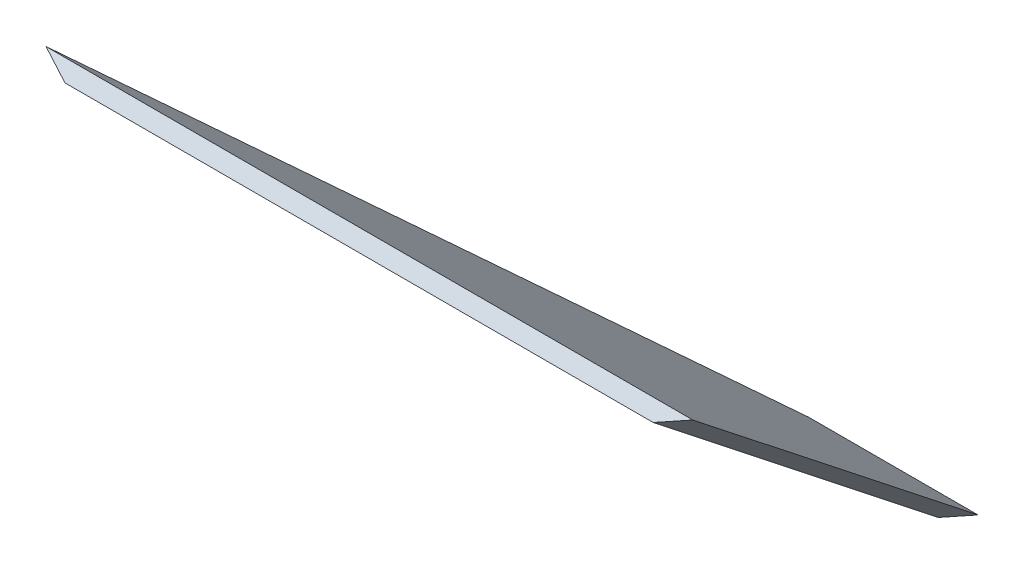
ISO-10303-21;
HEADER;
FILE_DESCRIPTION(('STEP AP214'),'2;1');
FILE_NAME('part.step','',(''),(''),'','','');
FILE_SCHEMA(('AUTOMOTIVE_DESIGN { 1 0 10303 214 1 1 1 1 }'));
ENDSEC;
DATA;
#1=APPLICATION_CONTEXT('core data for automotive mechanical design processes');
#2=APPLICATION_PROTOCOL_DEFINITION('international standard','automotive_design',2000,#1);
#3=PRODUCT_CONTEXT('',#1,'mechanical');
#4=PRODUCT('Part','Part','',(#3));
#5=PRODUCT_RELATED_PRODUCT_CATEGORY('part','',(#4));
#6=PRODUCT_DEFINITION_FORMATION('','',#4);
#7=PRODUCT_DEFINITION_CONTEXT('part definition',#1,'design');
#8=PRODUCT_DEFINITION('design','',#6,#7);
#9=PRODUCT_DEFINITION_SHAPE('','',#8);
#10=(LENGTH_UNIT() NAMED_UNIT(*) SI_UNIT(.MILLI.,.METRE.));
#11=(NAMED_UNIT(*) PLANE_ANGLE_UNIT() SI_UNIT($,.RADIAN.));
#12=(NAMED_UNIT(*) SI_UNIT($,.STERADIAN.) SOLID_ANGLE_UNIT());
#13=UNCERTAINTY_MEASURE_WITH_UNIT(LENGTH_MEASURE(1.E-05),#10,'distance_accuracy_value','');
#14=(GEOMETRIC_REPRESENTATION_CONTEXT(3) GLOBAL_UNCERTAINTY_ASSIGNED_CONTEXT((#13)) GLOBAL_UNIT_ASSIGNED_CONTEXT((#10,
#11,#12)) REPRESENTATION_CONTEXT('',''));
#15=CARTESIAN_POINT('',(0.,0.,0.));
#16=DIRECTION('',(0.,0.,1.));
#17=DIRECTION('',(1.,0.,0.));
#18=AXIS2_PLACEMENT_3D('',#15,#16,#17);
#19=CARTESIAN_POINT('',(-204.997061337424,361.646186737307,597.997319736598));
#20=DIRECTION('',(0.463959634932344,0.757671489646815,-0.458993868074316));
#21=DIRECTION('',(0.852811638118469,-0.522218641844289,0.));
#22=AXIS2_PLACEMENT_3D('',#19,#20,#21);
#23=PLANE('',#22);
#24=DIRECTION('',(0.8827255532639,-0.351898381996991,0.31138902736423));
#25=VECTOR('',#24,1.);
#26=CARTESIAN_POINT('',(153.967453450851,218.545047905128,724.625138207348));
#27=LINE('',#26,#25);
#28=CARTESIAN_POINT('',(-184.121302657974,353.324069319163,605.361423071602));
#29=VERTEX_POINT('',#28);
#30=CARTESIAN_POINT('',(-204.997061337424,361.646186737307,597.997319736598));
#31=VERTEX_POINT('',#30);
#32=EDGE_CURVE('E90',#29,#31,#27,.F.);
#33=ORIENTED_EDGE('',*,*,#32,.T.);
#34=DIRECTION('',(-0.323023809091168,0.62716039849875,0.708749217505827));
#35=VECTOR('',#34,1.);
#36=CARTESIAN_POINT('',(-204.997061337424,361.646186737307,597.997319736598));
#37=LINE('',#36,#35);
#38=CARTESIAN_POINT('',(-34.9249999999667,31.4461867373068,224.84079999998));
#39=VERTEX_POINT('',#38);
#40=EDGE_CURVE('E81',#39,#31,#37,.T.);
#41=ORIENTED_EDGE('',*,*,#40,.F.);
#42=DIRECTION('',(0.8827255532639,-0.351898381996991,0.31138902736423));
#43=VECTOR('',#42,1.);
#44=CARTESIAN_POINT('',(-34.9249999999668,31.4461867373068,224.84079999998));
#45=LINE('',#44,#43);
#46=CARTESIAN_POINT('',(-14.0492413205163,23.1240693191629,232.204903334985));
#47=VERTEX_POINT('',#46);
#48=EDGE_CURVE('E123',#39,#47,#45,.T.);
#49=ORIENTED_EDGE('',*,*,#48,.T.);
#50=DIRECTION('',(-0.323023809091169,0.62716039849875,0.708749217505826));
#51=VECTOR('',#50,1.);
#52=CARTESIAN_POINT('',(-186.299570780292,357.553242108233,610.140779217375));
#53=LINE('',#52,#51);
#54=EDGE_CURVE('E91',#47,#29,#53,.T.);
#55=ORIENTED_EDGE('',*,*,#54,.T.);
#56=EDGE_LOOP('',(#33,#41,#49,#55));
#57=FACE_BOUND('',#56,.T.);
#58=ADVANCED_FACE('F41',(#57),#23,.F.);
#59=CARTESIAN_POINT('',(255.683748074746,361.646186737307,597.997319736598));
#60=DIRECTION('',(-0.463959634932353,0.757671489646803,-0.458993868074326));
#61=DIRECTION('',(0.852811638118461,0.522218641844302,0.));
#62=AXIS2_PLACEMENT_3D('',#59,#60,#61);
#63=PLANE('',#62);
#64=DIRECTION('',(0.882725553263896,0.351898381996997,-0.311389027364235));
#65=VECTOR('',#64,1.);
#66=CARTESIAN_POINT('',(255.683748074746,361.646186737307,597.997319736598));
#67=LINE('',#66,#65);
#68=CARTESIAN_POINT('',(255.683748074746,361.646186737307,597.997319736598));
#69=VERTEX_POINT('',#68);
#70=CARTESIAN_POINT('',(234.807989395296,353.324069319163,605.361423071602));
#71=VERTEX_POINT('',#70);
#72=EDGE_CURVE('E95',#69,#71,#67,.F.);
#73=ORIENTED_EDGE('',*,*,#72,.T.);
#74=DIRECTION('',(-0.323023809091136,-0.627160398498758,-0.708749217505835));
#75=VECTOR('',#74,1.);
#76=CARTESIAN_POINT('',(188.916803510475,264.224957683758,504.671191667931));
#77=LINE('',#76,#75);
#78=CARTESIAN_POINT('',(64.7359280578578,23.1240693191629,232.204903334985));
#79=VERTEX_POINT('',#78);
#80=EDGE_CURVE('E125',#71,#79,#77,.T.);
#81=ORIENTED_EDGE('',*,*,#80,.T.);
#82=DIRECTION('',(0.882725553263896,0.351898381996997,-0.311389027364235));
#83=VECTOR('',#82,1.);
#84=CARTESIAN_POINT('',(-8.31103021728433,-5.9960873725512,257.972845823008));
#85=LINE('',#84,#83);
#86=CARTESIAN_POINT('',(85.6116867373077,31.4461867373068,224.84079999998));
#87=VERTEX_POINT('',#86);
#88=EDGE_CURVE('E96',#79,#87,#85,.T.);
#89=ORIENTED_EDGE('',*,*,#88,.T.);
#90=CARTESIAN_POINT('',(255.683748074746,361.646186737307,597.997319736598));
#91=CARTESIAN_POINT('',(198.993060962267,251.57952007064,473.611813157725));
#92=CARTESIAN_POINT('',(142.302373849787,141.512853403974,349.226306578853));
#93=CARTESIAN_POINT('',(85.6116867373077,31.4461867373069,224.84079999998));
#94=B_SPLINE_CURVE_WITH_KNOTS('',3,(#90,#91,#92,#93),.UNSPECIFIED.,.F.,.F.,(4,4),(0.,1.),.UNSPECIFIED.);
#95=EDGE_CURVE('E60',#87,#69,#94,.F.);
#96=ORIENTED_EDGE('',*,*,#95,.T.);
#97=EDGE_LOOP('',(#73,#81,#89,#96));
#98=FACE_BOUND('',#97,.T.);
#99=ADVANCED_FACE('F43',(#98),#63,.F.);
#100=CARTESIAN_POINT('',(-204.997061337424,361.646186737307,597.997319736598));
#101=DIRECTION('',(0.,-0.748896955513514,0.662686464342369));
#102=DIRECTION('',(0.323023809091168,-0.62716039849875,-0.708749217505826));
#103=AXIS2_PLACEMENT_3D('',#100,#101,#102);
#104=PLANE('',#103);
#105=ORIENTED_EDGE('',*,*,#40,.T.);
#106=CARTESIAN_POINT('',(-204.997061337424,361.646186737307,597.997319736598));
#107=CARTESIAN_POINT('',(-51.4367915333674,361.646186737307,597.997319736598));
#108=CARTESIAN_POINT('',(102.123478270689,361.646186737307,597.997319736598));
#109=CARTESIAN_POINT('',(255.683748074746,361.646186737307,597.997319736598));
#110=B_SPLINE_CURVE_WITH_KNOTS('',3,(#106,#107,#108,#109),.UNSPECIFIED.,.F.,.F.,(4,4),(0.,1.),.UNSPECIFIED.);
#111=EDGE_CURVE('E11',#69,#31,#110,.F.);
#112=ORIENTED_EDGE('',*,*,#111,.F.);
#113=ORIENTED_EDGE('',*,*,#95,.F.);
#114=CARTESIAN_POINT('',(-34.9249999999667,31.4461867373069,224.84079999998));
#115=CARTESIAN_POINT('',(5.25389557912477,31.4461867373069,224.84079999998));
#116=CARTESIAN_POINT('',(45.4327911582162,31.4461867373069,224.84079999998));
#117=CARTESIAN_POINT('',(85.6116867373077,31.4461867373069,224.84079999998));
#118=B_SPLINE_CURVE_WITH_KNOTS('',3,(#114,#115,#116,#117),.UNSPECIFIED.,.F.,.F.,(4,4),(0.,1.),.UNSPECIFIED.);
#119=EDGE_CURVE('E53',#39,#87,#118,.T.);
#120=ORIENTED_EDGE('',*,*,#119,.F.);
#121=EDGE_LOOP('',(#105,#112,#113,#120));
#122=FACE_BOUND('',#121,.T.);
#123=ADVANCED_FACE('F83',(#122),#104,.F.);
#124=CARTESIAN_POINT('',(-204.997061337424,353.324069319163,605.361423071602));
#125=DIRECTION('',(0.,-0.748896955513514,0.662686464342369));
#126=DIRECTION('',(0.323023809091168,-0.62716039849875,-0.708749217505826));
#127=AXIS2_PLACEMENT_3D('',#124,#125,#126);
#128=PLANE('',#127);
#129=ORIENTED_EDGE('',*,*,#80,.F.);
#130=DIRECTION('',(-1.,0.,0.));
#131=VECTOR('',#130,1.);
#132=CARTESIAN_POINT('',(25.3663774091317,353.324069319163,605.361423071602));
#133=LINE('',#132,#131);
#134=EDGE_CURVE('E87',#71,#29,#133,.T.);
#135=ORIENTED_EDGE('',*,*,#134,.T.);
#136=ORIENTED_EDGE('',*,*,#54,.F.);
#137=DIRECTION('',(1.,0.,0.));
#138=VECTOR('',#137,1.);
#139=CARTESIAN_POINT('',(25.9460268023569,23.1240693191629,232.204903334985));
#140=LINE('',#139,#138);
#141=EDGE_CURVE('E103',#47,#79,#140,.T.);
#142=ORIENTED_EDGE('',*,*,#141,.T.);
#143=EDGE_LOOP('',(#129,#135,#136,#142));
#144=FACE_BOUND('',#143,.T.);
#145=ADVANCED_FACE('F140',(#144),#128,.T.);
#146=CARTESIAN_POINT('',(-34.9249999999667,31.4461867373069,224.84079999998));
#147=DIRECTION('',(0.,-0.662686464342369,-0.748896955513514));
#148=DIRECTION('',(1.,0.,0.));
#149=AXIS2_PLACEMENT_3D('',#146,#147,#148);
#150=PLANE('',#149);
#151=ORIENTED_EDGE('',*,*,#88,.F.);
#152=ORIENTED_EDGE('',*,*,#141,.F.);
#153=ORIENTED_EDGE('',*,*,#48,.F.);
#154=ORIENTED_EDGE('',*,*,#119,.T.);
#155=EDGE_LOOP('',(#151,#152,#153,#154));
#156=FACE_BOUND('',#155,.T.);
#157=ADVANCED_FACE('F128',(#156),#150,.T.);
#158=CARTESIAN_POINT('',(255.683748074746,361.646186737307,597.997319736598));
#159=DIRECTION('',(0.,-0.662686464342369,-0.748896955513514));
#160=DIRECTION('',(1.,0.,0.));
#161=AXIS2_PLACEMENT_3D('',#158,#159,#160);
#162=PLANE('',#161);
#163=ORIENTED_EDGE('',*,*,#72,.F.);
#164=ORIENTED_EDGE('',*,*,#111,.T.);
#165=ORIENTED_EDGE('',*,*,#32,.F.);
#166=ORIENTED_EDGE('',*,*,#134,.F.);
#167=EDGE_LOOP('',(#163,#164,#165,#166));
#168=FACE_BOUND('',#167,.T.);
#169=ADVANCED_FACE('F99',(#168),#162,.F.);
#170=CLOSED_SHELL('',(#58,#99,#123,#145,#157,#169));
#171=MANIFOLD_SOLID_BREP('B2',#170);
#172=ADVANCED_BREP_SHAPE_REPRESENTATION('',(#18,#171),#14);
#173=SHAPE_DEFINITION_REPRESENTATION(#9,#172);
ENDSEC;
END-ISO-10303-21;
